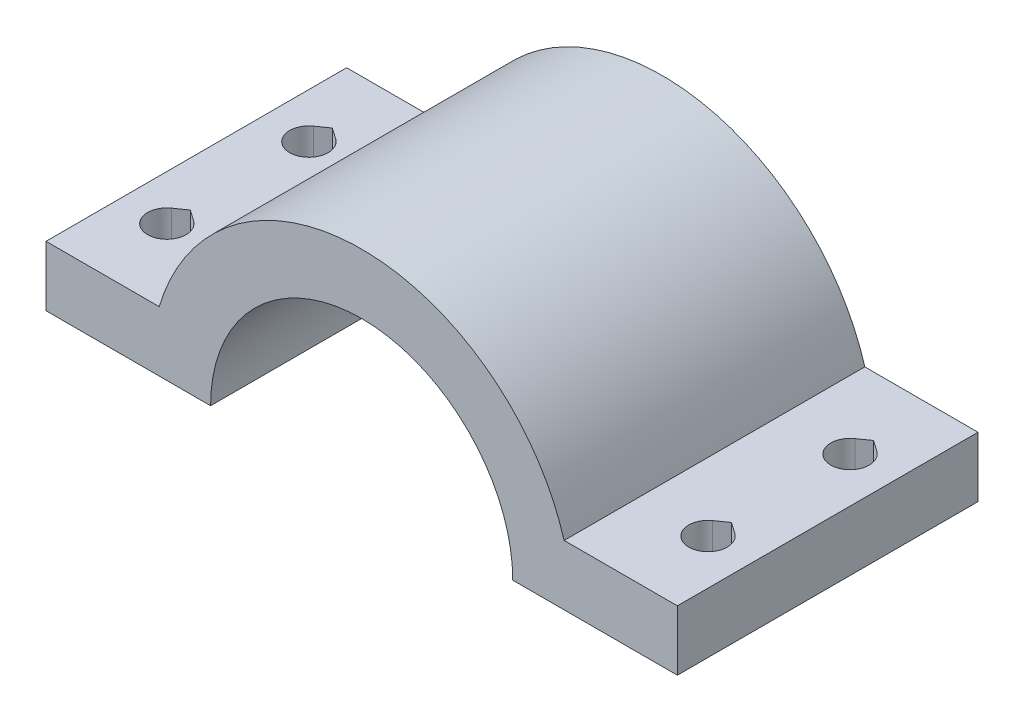
ISO-10303-21;
HEADER;
FILE_DESCRIPTION(('STEP AP214'),'2;1');
FILE_NAME('part.step','',(''),(''),'','','');
FILE_SCHEMA(('AUTOMOTIVE_DESIGN { 1 0 10303 214 1 1 1 1 }'));
ENDSEC;
DATA;
#1=APPLICATION_CONTEXT('core data for automotive mechanical design processes');
#2=APPLICATION_PROTOCOL_DEFINITION('international standard','automotive_design',2000,#1);
#3=PRODUCT_CONTEXT('',#1,'mechanical');
#4=PRODUCT('Part','Part','',(#3));
#5=PRODUCT_RELATED_PRODUCT_CATEGORY('part','',(#4));
#6=PRODUCT_DEFINITION_FORMATION('','',#4);
#7=PRODUCT_DEFINITION_CONTEXT('part definition',#1,'design');
#8=PRODUCT_DEFINITION('design','',#6,#7);
#9=PRODUCT_DEFINITION_SHAPE('','',#8);
#10=(LENGTH_UNIT() NAMED_UNIT(*) SI_UNIT(.MILLI.,.METRE.));
#11=(NAMED_UNIT(*) PLANE_ANGLE_UNIT() SI_UNIT($,.RADIAN.));
#12=(NAMED_UNIT(*) SI_UNIT($,.STERADIAN.) SOLID_ANGLE_UNIT());
#13=UNCERTAINTY_MEASURE_WITH_UNIT(LENGTH_MEASURE(1.E-05),#10,'distance_accuracy_value','');
#14=(GEOMETRIC_REPRESENTATION_CONTEXT(3) GLOBAL_UNCERTAINTY_ASSIGNED_CONTEXT((#13)) GLOBAL_UNIT_ASSIGNED_CONTEXT((#10,
#11,#12)) REPRESENTATION_CONTEXT('',''));
#15=CARTESIAN_POINT('',(0.,0.,0.));
#16=DIRECTION('',(0.,0.,1.));
#17=DIRECTION('',(1.,0.,0.));
#18=AXIS2_PLACEMENT_3D('',#15,#16,#17);
#19=CARTESIAN_POINT('',(0.,1.46237189024843E-13,25.4));
#20=DIRECTION('',(0.,1.,0.));
#21=DIRECTION('',(-1.,0.,0.));
#22=AXIS2_PLACEMENT_3D('',#19,#20,#21);
#23=PLANE('',#22);
#24=CARTESIAN_POINT('',(22.8599999999999,0.,18.9999998460001));
#25=DIRECTION('',(0.,1.,0.));
#26=DIRECTION('',(0.,0.,1.));
#27=AXIS2_PLACEMENT_3D('',#24,#25,#26);
#28=CIRCLE('',#27,1.625000052);
#29=CARTESIAN_POINT('',(23.7920617388964,0.,17.6688777314346));
#30=VERTEX_POINT('',#29);
#31=CARTESIAN_POINT('',(21.9279382611035,0.,17.6688777314345));
#32=VERTEX_POINT('',#31);
#33=EDGE_CURVE('E224',#30,#32,#28,.F.);
#34=ORIENTED_EDGE('',*,*,#33,.F.);
#35=DIRECTION('',(0.819152044288987,0.,0.573576436351053));
#36=VECTOR('',#35,1.);
#37=CARTESIAN_POINT('',(-0.474308324425683,0.,0.677382488109719));
#38=LINE('',#37,#36);
#39=CARTESIAN_POINT('',(22.8599999999999,0.,17.0162410757824));
#40=VERTEX_POINT('',#39);
#41=EDGE_CURVE('E227',#40,#30,#38,.T.);
#42=ORIENTED_EDGE('',*,*,#41,.F.);
#43=DIRECTION('',(-0.819152044288995,0.,0.573576436351041));
#44=VECTOR('',#43,1.);
#45=CARTESIAN_POINT('',(15.5157278480008,0.,22.1587557992758));
#46=LINE('',#45,#44);
#47=EDGE_CURVE('E231',#40,#32,#46,.T.);
#48=ORIENTED_EDGE('',*,*,#47,.T.);
#49=EDGE_LOOP('',(#34,#42,#48));
#50=FACE_BOUND('',#49,.T.);
#51=DIRECTION('',(1.,0.,0.));
#52=VECTOR('',#51,1.);
#53=CARTESIAN_POINT('',(0.,1.46237189024843E-13,0.));
#54=LINE('',#53,#52);
#55=CARTESIAN_POINT('',(12.7634999999999,0.,0.));
#56=VERTEX_POINT('',#55);
#57=CARTESIAN_POINT('',(26.6699999999999,0.,0.));
#58=VERTEX_POINT('',#57);
#59=EDGE_CURVE('E355',#56,#58,#54,.T.);
#60=ORIENTED_EDGE('',*,*,#59,.T.);
#61=DIRECTION('',(0.,0.,-1.));
#62=VECTOR('',#61,1.);
#63=CARTESIAN_POINT('',(26.6699999999999,0.,25.4));
#64=LINE('',#63,#62);
#65=CARTESIAN_POINT('',(26.6699999999999,0.,25.4));
#66=VERTEX_POINT('',#65);
#67=EDGE_CURVE('E391',#66,#58,#64,.T.);
#68=ORIENTED_EDGE('',*,*,#67,.F.);
#69=DIRECTION('',(1.,0.,0.));
#70=VECTOR('',#69,1.);
#71=CARTESIAN_POINT('',(0.,1.46237189024843E-13,25.4));
#72=LINE('',#71,#70);
#73=CARTESIAN_POINT('',(12.7634999999999,0.,25.4));
#74=VERTEX_POINT('',#73);
#75=EDGE_CURVE('E327',#74,#66,#72,.T.);
#76=ORIENTED_EDGE('',*,*,#75,.F.);
#77=DIRECTION('',(0.,0.,-1.));
#78=VECTOR('',#77,1.);
#79=CARTESIAN_POINT('',(12.7634999999999,0.,25.4));
#80=LINE('',#79,#78);
#81=EDGE_CURVE('E55',#74,#56,#80,.T.);
#82=ORIENTED_EDGE('',*,*,#81,.T.);
#83=EDGE_LOOP('',(#60,#68,#76,#82));
#84=FACE_BOUND('',#83,.T.);
#85=CARTESIAN_POINT('',(22.86,0.,6.99999997000007));
#86=DIRECTION('',(0.,1.,0.));
#87=DIRECTION('',(0.,0.,1.));
#88=AXIS2_PLACEMENT_3D('',#85,#86,#87);
#89=CIRCLE('',#88,1.625000052);
#90=CARTESIAN_POINT('',(23.7920617388964,0.,5.66887785543456));
#91=VERTEX_POINT('',#90);
#92=CARTESIAN_POINT('',(21.9279382611035,0.,5.66887785543455));
#93=VERTEX_POINT('',#92);
#94=EDGE_CURVE('E256',#91,#93,#89,.F.);
#95=ORIENTED_EDGE('',*,*,#94,.F.);
#96=DIRECTION('',(-0.819152044288988,0.,-0.573576436351051));
#97=VECTOR('',#96,1.);
#98=CARTESIAN_POINT('',(5.16384734202883,0.,-7.37473828863894));
#99=LINE('',#98,#97);
#100=CARTESIAN_POINT('',(22.86,0.,5.01624119978242));
#101=VERTEX_POINT('',#100);
#102=EDGE_CURVE('E259',#91,#101,#99,.T.);
#103=ORIENTED_EDGE('',*,*,#102,.T.);
#104=DIRECTION('',(-0.81915204428899,0.,0.573576436351048));
#105=VECTOR('',#104,1.);
#106=CARTESIAN_POINT('',(9.87757218154655,0.,14.106635022527));
#107=LINE('',#106,#105);
#108=EDGE_CURVE('E264',#101,#93,#107,.T.);
#109=ORIENTED_EDGE('',*,*,#108,.T.);
#110=EDGE_LOOP('',(#95,#103,#109));
#111=FACE_BOUND('',#110,.T.);
#112=ADVANCED_FACE('F46',(#50,#84,#111),#23,.F.);
#113=CARTESIAN_POINT('',(0.,5.08000000000001,25.4));
#114=DIRECTION('',(0.,-1.,0.));
#115=DIRECTION('',(1.,0.,0.));
#116=AXIS2_PLACEMENT_3D('',#113,#114,#115);
#117=PLANE('',#116);
#118=CARTESIAN_POINT('',(22.8599999999999,5.08,18.9999998460001));
#119=DIRECTION('',(0.,1.,0.));
#120=DIRECTION('',(0.,0.,1.));
#121=AXIS2_PLACEMENT_3D('',#118,#119,#120);
#122=CIRCLE('',#121,1.625000052);
#123=CARTESIAN_POINT('',(23.7920617388964,5.08000000000008,17.6688777314346));
#124=VERTEX_POINT('',#123);
#125=CARTESIAN_POINT('',(21.9279382611035,5.08,17.6688777314345));
#126=VERTEX_POINT('',#125);
#127=EDGE_CURVE('E236',#124,#126,#122,.F.);
#128=ORIENTED_EDGE('',*,*,#127,.T.);
#129=DIRECTION('',(-0.819152044288995,0.,0.573576436351041));
#130=VECTOR('',#129,1.);
#131=CARTESIAN_POINT('',(15.5157278480008,5.08,22.1587557992758));
#132=LINE('',#131,#130);
#133=CARTESIAN_POINT('',(22.8599999999999,5.08,17.0162410757824));
#134=VERTEX_POINT('',#133);
#135=EDGE_CURVE('E228',#134,#126,#132,.T.);
#136=ORIENTED_EDGE('',*,*,#135,.F.);
#137=DIRECTION('',(0.819152044288987,0.,0.573576436351053));
#138=VECTOR('',#137,1.);
#139=CARTESIAN_POINT('',(-0.474308324425683,5.08,0.677382488109719));
#140=LINE('',#139,#138);
#141=EDGE_CURVE('E240',#134,#124,#140,.T.);
#142=ORIENTED_EDGE('',*,*,#141,.T.);
#143=EDGE_LOOP('',(#128,#136,#142));
#144=FACE_BOUND('',#143,.T.);
#145=DIRECTION('',(-1.,0.,0.));
#146=VECTOR('',#145,1.);
#147=CARTESIAN_POINT('',(0.,5.08000000000001,0.));
#148=LINE('',#147,#146);
#149=CARTESIAN_POINT('',(26.6699999999999,5.08000000000009,0.));
#150=VERTEX_POINT('',#149);
#151=CARTESIAN_POINT('',(17.1050896592212,5.08000000000006,0.));
#152=VERTEX_POINT('',#151);
#153=EDGE_CURVE('E361',#150,#152,#148,.T.);
#154=ORIENTED_EDGE('',*,*,#153,.T.);
#155=DIRECTION('',(0.,0.,-1.));
#156=VECTOR('',#155,1.);
#157=CARTESIAN_POINT('',(17.1050896592212,5.08000000000006,25.4));
#158=LINE('',#157,#156);
#159=CARTESIAN_POINT('',(17.1050896592212,5.08000000000006,25.4));
#160=VERTEX_POINT('',#159);
#161=EDGE_CURVE('E383',#160,#152,#158,.T.);
#162=ORIENTED_EDGE('',*,*,#161,.F.);
#163=DIRECTION('',(-1.,0.,0.));
#164=VECTOR('',#163,1.);
#165=CARTESIAN_POINT('',(0.,5.08000000000001,25.4));
#166=LINE('',#165,#164);
#167=CARTESIAN_POINT('',(26.6699999999999,5.08000000000009,25.4));
#168=VERTEX_POINT('',#167);
#169=EDGE_CURVE('E333',#168,#160,#166,.T.);
#170=ORIENTED_EDGE('',*,*,#169,.F.);
#171=DIRECTION('',(0.,0.,-1.));
#172=VECTOR('',#171,1.);
#173=CARTESIAN_POINT('',(26.6699999999999,5.08000000000009,25.4));
#174=LINE('',#173,#172);
#175=EDGE_CURVE('E387',#168,#150,#174,.T.);
#176=ORIENTED_EDGE('',*,*,#175,.T.);
#177=EDGE_LOOP('',(#154,#162,#170,#176));
#178=FACE_BOUND('',#177,.T.);
#179=CARTESIAN_POINT('',(22.86,5.08,6.99999997000007));
#180=DIRECTION('',(0.,1.,0.));
#181=DIRECTION('',(0.,0.,1.));
#182=AXIS2_PLACEMENT_3D('',#179,#180,#181);
#183=CIRCLE('',#182,1.625000052);
#184=CARTESIAN_POINT('',(23.7920617388964,5.08000000000008,5.66887785543456));
#185=VERTEX_POINT('',#184);
#186=CARTESIAN_POINT('',(21.9279382611035,5.08,5.66887785543455));
#187=VERTEX_POINT('',#186);
#188=EDGE_CURVE('E269',#185,#187,#183,.F.);
#189=ORIENTED_EDGE('',*,*,#188,.T.);
#190=DIRECTION('',(-0.81915204428899,0.,0.573576436351048));
#191=VECTOR('',#190,1.);
#192=CARTESIAN_POINT('',(9.87757218154655,5.08,14.106635022527));
#193=LINE('',#192,#191);
#194=CARTESIAN_POINT('',(22.86,5.08,5.01624119978241));
#195=VERTEX_POINT('',#194);
#196=EDGE_CURVE('E260',#195,#187,#193,.T.);
#197=ORIENTED_EDGE('',*,*,#196,.F.);
#198=DIRECTION('',(-0.819152044288988,0.,-0.573576436351051));
#199=VECTOR('',#198,1.);
#200=CARTESIAN_POINT('',(5.16384734202883,5.08,-7.37473828863894));
#201=LINE('',#200,#199);
#202=EDGE_CURVE('E273',#185,#195,#201,.T.);
#203=ORIENTED_EDGE('',*,*,#202,.F.);
#204=EDGE_LOOP('',(#189,#197,#203));
#205=FACE_BOUND('',#204,.T.);
#206=ADVANCED_FACE('F427',(#144,#178,#205),#117,.F.);
#207=CARTESIAN_POINT('',(0.,0.,25.4));
#208=DIRECTION('',(0.,-1.,0.));
#209=DIRECTION('',(1.,0.,0.));
#210=AXIS2_PLACEMENT_3D('',#207,#208,#209);
#211=PLANE('',#210);
#212=CARTESIAN_POINT('',(-22.86,0.,18.999999846));
#213=DIRECTION('',(0.,1.,0.));
#214=DIRECTION('',(0.,0.,1.));
#215=AXIS2_PLACEMENT_3D('',#212,#213,#214);
#216=CIRCLE('',#215,1.625000052);
#217=CARTESIAN_POINT('',(-23.7920617388964,0.,17.6688777314345));
#218=VERTEX_POINT('',#217);
#219=CARTESIAN_POINT('',(-21.9279382611036,0.,17.6688777314345));
#220=VERTEX_POINT('',#219);
#221=EDGE_CURVE('E193',#218,#220,#216,.T.);
#222=ORIENTED_EDGE('',*,*,#221,.T.);
#223=DIRECTION('',(0.81915204428899,0.,0.573576436351048));
#224=VECTOR('',#223,1.);
#225=CARTESIAN_POINT('',(-15.515727848001,0.,22.1587557992757));
#226=LINE('',#225,#224);
#227=CARTESIAN_POINT('',(-22.86,0.,17.0162410757823));
#228=VERTEX_POINT('',#227);
#229=EDGE_CURVE('E183',#228,#220,#226,.T.);
#230=ORIENTED_EDGE('',*,*,#229,.F.);
#231=DIRECTION('',(-0.819152044288989,0.,0.57357643635105));
#232=VECTOR('',#231,1.);
#233=CARTESIAN_POINT('',(0.474308324425689,0.,0.677382488109733));
#234=LINE('',#233,#232);
#235=EDGE_CURVE('E62',#228,#218,#234,.T.);
#236=ORIENTED_EDGE('',*,*,#235,.T.);
#237=EDGE_LOOP('',(#222,#230,#236));
#238=FACE_BOUND('',#237,.T.);
#239=CARTESIAN_POINT('',(-22.86,0.,6.99999997));
#240=DIRECTION('',(0.,1.,0.));
#241=DIRECTION('',(0.,0.,1.));
#242=AXIS2_PLACEMENT_3D('',#239,#240,#241);
#243=CIRCLE('',#242,1.625000052);
#244=CARTESIAN_POINT('',(-23.7920617388964,0.,5.66887785543448));
#245=VERTEX_POINT('',#244);
#246=CARTESIAN_POINT('',(-21.9279382611036,0.,5.66887785543448));
#247=VERTEX_POINT('',#246);
#248=EDGE_CURVE('E288',#245,#247,#243,.T.);
#249=ORIENTED_EDGE('',*,*,#248,.T.);
#250=DIRECTION('',(0.819152044288989,0.,0.57357643635105));
#251=VECTOR('',#250,1.);
#252=CARTESIAN_POINT('',(-9.87757218154658,0.,14.106635022527));
#253=LINE('',#252,#251);
#254=CARTESIAN_POINT('',(-22.86,0.,5.01624119978234));
#255=VERTEX_POINT('',#254);
#256=EDGE_CURVE('E292',#255,#247,#253,.T.);
#257=ORIENTED_EDGE('',*,*,#256,.F.);
#258=DIRECTION('',(0.819152044288989,0.,-0.57357643635105));
#259=VECTOR('',#258,1.);
#260=CARTESIAN_POINT('',(-5.16384734202884,0.,-7.37473828863898));
#261=LINE('',#260,#259);
#262=EDGE_CURVE('E296',#245,#255,#261,.T.);
#263=ORIENTED_EDGE('',*,*,#262,.F.);
#264=EDGE_LOOP('',(#249,#257,#263));
#265=FACE_BOUND('',#264,.T.);
#266=DIRECTION('',(-1.,0.,0.));
#267=VECTOR('',#266,1.);
#268=CARTESIAN_POINT('',(0.,0.,0.));
#269=LINE('',#268,#267);
#270=CARTESIAN_POINT('',(-12.7635,0.,0.));
#271=VERTEX_POINT('',#270);
#272=CARTESIAN_POINT('',(-26.67,0.,0.));
#273=VERTEX_POINT('',#272);
#274=EDGE_CURVE('E312',#271,#273,#269,.T.);
#275=ORIENTED_EDGE('',*,*,#274,.F.);
#276=DIRECTION('',(0.,0.,-1.));
#277=VECTOR('',#276,1.);
#278=CARTESIAN_POINT('',(-12.7635,0.,25.4));
#279=LINE('',#278,#277);
#280=CARTESIAN_POINT('',(-12.7635,0.,25.4));
#281=VERTEX_POINT('',#280);
#282=EDGE_CURVE('E11',#281,#271,#279,.T.);
#283=ORIENTED_EDGE('',*,*,#282,.F.);
#284=DIRECTION('',(-1.,0.,0.));
#285=VECTOR('',#284,1.);
#286=CARTESIAN_POINT('',(0.,0.,25.4));
#287=LINE('',#286,#285);
#288=CARTESIAN_POINT('',(-26.67,0.,25.4));
#289=VERTEX_POINT('',#288);
#290=EDGE_CURVE('E318',#281,#289,#287,.T.);
#291=ORIENTED_EDGE('',*,*,#290,.T.);
#292=DIRECTION('',(0.,0.,-1.));
#293=VECTOR('',#292,1.);
#294=CARTESIAN_POINT('',(-26.67,0.,25.4));
#295=LINE('',#294,#293);
#296=EDGE_CURVE('E347',#289,#273,#295,.T.);
#297=ORIENTED_EDGE('',*,*,#296,.T.);
#298=EDGE_LOOP('',(#275,#283,#291,#297));
#299=FACE_BOUND('',#298,.T.);
#300=ADVANCED_FACE('F48',(#238,#265,#299),#211,.T.);
#301=CARTESIAN_POINT('',(0.,0.,25.4));
#302=DIRECTION('',(0.,0.,-1.));
#303=DIRECTION('',(-1.,0.,0.));
#304=AXIS2_PLACEMENT_3D('',#301,#302,#303);
#305=CYLINDRICAL_SURFACE('',#304,12.7635);
#306=CARTESIAN_POINT('',(0.,0.,0.));
#307=DIRECTION('',(0.,0.,1.));
#308=DIRECTION('',(1.,0.,0.));
#309=AXIS2_PLACEMENT_3D('',#306,#307,#308);
#310=CIRCLE('',#309,12.7635);
#311=EDGE_CURVE('E351',#56,#271,#310,.T.);
#312=ORIENTED_EDGE('',*,*,#311,.F.);
#313=ORIENTED_EDGE('',*,*,#81,.F.);
#314=CARTESIAN_POINT('',(0.,0.,25.4));
#315=DIRECTION('',(0.,0.,1.));
#316=DIRECTION('',(1.,0.,0.));
#317=AXIS2_PLACEMENT_3D('',#314,#315,#316);
#318=CIRCLE('',#317,12.7635);
#319=EDGE_CURVE('E322',#74,#281,#318,.T.);
#320=ORIENTED_EDGE('',*,*,#319,.T.);
#321=ORIENTED_EDGE('',*,*,#282,.T.);
#322=EDGE_LOOP('',(#312,#313,#320,#321));
#323=FACE_BOUND('',#322,.T.);
#324=ADVANCED_FACE('F407',(#323),#305,.F.);
#325=CARTESIAN_POINT('',(26.6699999999999,0.,25.4));
#326=DIRECTION('',(-1.,0.,0.));
#327=DIRECTION('',(0.,-1.,0.));
#328=AXIS2_PLACEMENT_3D('',#325,#326,#327);
#329=PLANE('',#328);
#330=DIRECTION('',(0.,1.,0.));
#331=VECTOR('',#330,1.);
#332=CARTESIAN_POINT('',(26.6699999999999,0.,0.));
#333=LINE('',#332,#331);
#334=EDGE_CURVE('E358',#58,#150,#333,.T.);
#335=ORIENTED_EDGE('',*,*,#334,.T.);
#336=ORIENTED_EDGE('',*,*,#175,.F.);
#337=DIRECTION('',(0.,1.,0.));
#338=VECTOR('',#337,1.);
#339=CARTESIAN_POINT('',(26.6699999999999,0.,25.4));
#340=LINE('',#339,#338);
#341=EDGE_CURVE('E330',#66,#168,#340,.T.);
#342=ORIENTED_EDGE('',*,*,#341,.F.);
#343=ORIENTED_EDGE('',*,*,#67,.T.);
#344=EDGE_LOOP('',(#335,#336,#342,#343));
#345=FACE_BOUND('',#344,.T.);
#346=ADVANCED_FACE('F432',(#345),#329,.F.);
#347=CARTESIAN_POINT('',(0.,0.,25.4));
#348=DIRECTION('',(0.,0.,-1.));
#349=DIRECTION('',(-1.,0.,0.));
#350=AXIS2_PLACEMENT_3D('',#347,#348,#349);
#351=CYLINDRICAL_SURFACE('',#350,17.8435);
#352=CARTESIAN_POINT('',(0.,0.,0.));
#353=DIRECTION('',(0.,0.,1.));
#354=DIRECTION('',(1.,0.,0.));
#355=AXIS2_PLACEMENT_3D('',#352,#353,#354);
#356=CIRCLE('',#355,17.8435);
#357=CARTESIAN_POINT('',(-17.1050896592213,5.08,0.));
#358=VERTEX_POINT('',#357);
#359=EDGE_CURVE('E364',#152,#358,#356,.T.);
#360=ORIENTED_EDGE('',*,*,#359,.T.);
#361=DIRECTION('',(0.,0.,-1.));
#362=VECTOR('',#361,1.);
#363=CARTESIAN_POINT('',(-17.1050896592213,5.08,25.4));
#364=LINE('',#363,#362);
#365=CARTESIAN_POINT('',(-17.1050896592213,5.08,25.4));
#366=VERTEX_POINT('',#365);
#367=EDGE_CURVE('E380',#366,#358,#364,.T.);
#368=ORIENTED_EDGE('',*,*,#367,.F.);
#369=CARTESIAN_POINT('',(0.,0.,25.4));
#370=DIRECTION('',(0.,0.,1.));
#371=DIRECTION('',(1.,0.,0.));
#372=AXIS2_PLACEMENT_3D('',#369,#370,#371);
#373=CIRCLE('',#372,17.8435);
#374=EDGE_CURVE('E336',#160,#366,#373,.T.);
#375=ORIENTED_EDGE('',*,*,#374,.F.);
#376=ORIENTED_EDGE('',*,*,#161,.T.);
#377=EDGE_LOOP('',(#360,#368,#375,#376));
#378=FACE_BOUND('',#377,.T.);
#379=ADVANCED_FACE('F422',(#378),#351,.T.);
#380=CARTESIAN_POINT('',(0.,5.08,25.4));
#381=DIRECTION('',(0.,1.,0.));
#382=DIRECTION('',(0.,0.,1.));
#383=AXIS2_PLACEMENT_3D('',#380,#381,#382);
#384=PLANE('',#383);
#385=CARTESIAN_POINT('',(-22.86,5.08,18.999999846));
#386=DIRECTION('',(0.,1.,0.));
#387=DIRECTION('',(0.,0.,1.));
#388=AXIS2_PLACEMENT_3D('',#385,#386,#387);
#389=CIRCLE('',#388,1.625000052);
#390=CARTESIAN_POINT('',(-23.7920617388964,5.08,17.6688777314345));
#391=VERTEX_POINT('',#390);
#392=CARTESIAN_POINT('',(-21.9279382611036,5.08,17.6688777314345));
#393=VERTEX_POINT('',#392);
#394=EDGE_CURVE('E199',#391,#393,#389,.T.);
#395=ORIENTED_EDGE('',*,*,#394,.F.);
#396=DIRECTION('',(-0.819152044288989,0.,0.57357643635105));
#397=VECTOR('',#396,1.);
#398=CARTESIAN_POINT('',(0.474308324425689,5.08,0.677382488109733));
#399=LINE('',#398,#397);
#400=CARTESIAN_POINT('',(-22.86,5.08,17.0162410757824));
#401=VERTEX_POINT('',#400);
#402=EDGE_CURVE('E204',#401,#391,#399,.T.);
#403=ORIENTED_EDGE('',*,*,#402,.F.);
#404=DIRECTION('',(0.81915204428899,0.,0.573576436351048));
#405=VECTOR('',#404,1.);
#406=CARTESIAN_POINT('',(-15.515727848001,5.08,22.1587557992757));
#407=LINE('',#406,#405);
#408=EDGE_CURVE('E208',#401,#393,#407,.T.);
#409=ORIENTED_EDGE('',*,*,#408,.T.);
#410=EDGE_LOOP('',(#395,#403,#409));
#411=FACE_BOUND('',#410,.T.);
#412=CARTESIAN_POINT('',(-22.86,5.08,6.99999997));
#413=DIRECTION('',(0.,1.,0.));
#414=DIRECTION('',(0.,0.,1.));
#415=AXIS2_PLACEMENT_3D('',#412,#413,#414);
#416=CIRCLE('',#415,1.625000052);
#417=CARTESIAN_POINT('',(-23.7920617388964,5.08,5.66887785543448));
#418=VERTEX_POINT('',#417);
#419=CARTESIAN_POINT('',(-21.9279382611036,5.08,5.66887785543449));
#420=VERTEX_POINT('',#419);
#421=EDGE_CURVE('E221',#418,#420,#416,.T.);
#422=ORIENTED_EDGE('',*,*,#421,.F.);
#423=DIRECTION('',(0.819152044288989,0.,-0.57357643635105));
#424=VECTOR('',#423,1.);
#425=CARTESIAN_POINT('',(-5.16384734202884,5.08,-7.37473828863898));
#426=LINE('',#425,#424);
#427=CARTESIAN_POINT('',(-22.86,5.08,5.01624119978235));
#428=VERTEX_POINT('',#427);
#429=EDGE_CURVE('E293',#418,#428,#426,.T.);
#430=ORIENTED_EDGE('',*,*,#429,.T.);
#431=DIRECTION('',(0.819152044288989,0.,0.57357643635105));
#432=VECTOR('',#431,1.);
#433=CARTESIAN_POINT('',(-9.87757218154658,5.08,14.106635022527));
#434=LINE('',#433,#432);
#435=EDGE_CURVE('E302',#428,#420,#434,.T.);
#436=ORIENTED_EDGE('',*,*,#435,.T.);
#437=EDGE_LOOP('',(#422,#430,#436));
#438=FACE_BOUND('',#437,.T.);
#439=DIRECTION('',(1.,0.,0.));
#440=VECTOR('',#439,1.);
#441=CARTESIAN_POINT('',(0.,5.08,0.));
#442=LINE('',#441,#440);
#443=CARTESIAN_POINT('',(-26.67,5.08,0.));
#444=VERTEX_POINT('',#443);
#445=EDGE_CURVE('E368',#444,#358,#442,.T.);
#446=ORIENTED_EDGE('',*,*,#445,.F.);
#447=DIRECTION('',(0.,0.,-1.));
#448=VECTOR('',#447,1.);
#449=CARTESIAN_POINT('',(-26.67,5.08,25.4));
#450=LINE('',#449,#448);
#451=CARTESIAN_POINT('',(-26.67,5.08,25.4));
#452=VERTEX_POINT('',#451);
#453=EDGE_CURVE('E377',#452,#444,#450,.T.);
#454=ORIENTED_EDGE('',*,*,#453,.F.);
#455=DIRECTION('',(1.,0.,0.));
#456=VECTOR('',#455,1.);
#457=CARTESIAN_POINT('',(0.,5.08,25.4));
#458=LINE('',#457,#456);
#459=EDGE_CURVE('E339',#452,#366,#458,.T.);
#460=ORIENTED_EDGE('',*,*,#459,.T.);
#461=ORIENTED_EDGE('',*,*,#367,.T.);
#462=EDGE_LOOP('',(#446,#454,#460,#461));
#463=FACE_BOUND('',#462,.T.);
#464=ADVANCED_FACE('F418',(#411,#438,#463),#384,.T.);
#465=CARTESIAN_POINT('',(-26.67,0.,25.4));
#466=DIRECTION('',(-1.,0.,0.));
#467=DIRECTION('',(0.,0.,1.));
#468=AXIS2_PLACEMENT_3D('',#465,#466,#467);
#469=PLANE('',#468);
#470=DIRECTION('',(0.,1.,0.));
#471=VECTOR('',#470,1.);
#472=CARTESIAN_POINT('',(-26.67,0.,0.));
#473=LINE('',#472,#471);
#474=EDGE_CURVE('E323',#273,#444,#473,.T.);
#475=ORIENTED_EDGE('',*,*,#474,.F.);
#476=ORIENTED_EDGE('',*,*,#296,.F.);
#477=DIRECTION('',(0.,1.,0.));
#478=VECTOR('',#477,1.);
#479=CARTESIAN_POINT('',(-26.67,0.,25.4));
#480=LINE('',#479,#478);
#481=EDGE_CURVE('E343',#289,#452,#480,.T.);
#482=ORIENTED_EDGE('',*,*,#481,.T.);
#483=ORIENTED_EDGE('',*,*,#453,.T.);
#484=EDGE_LOOP('',(#475,#476,#482,#483));
#485=FACE_BOUND('',#484,.T.);
#486=ADVANCED_FACE('F413',(#485),#469,.T.);
#487=CARTESIAN_POINT('',(0.,0.,25.4));
#488=DIRECTION('',(0.,0.,1.));
#489=DIRECTION('',(1.,0.,0.));
#490=AXIS2_PLACEMENT_3D('',#487,#488,#489);
#491=PLANE('',#490);
#492=ORIENTED_EDGE('',*,*,#290,.F.);
#493=ORIENTED_EDGE('',*,*,#319,.F.);
#494=ORIENTED_EDGE('',*,*,#75,.T.);
#495=ORIENTED_EDGE('',*,*,#341,.T.);
#496=ORIENTED_EDGE('',*,*,#169,.T.);
#497=ORIENTED_EDGE('',*,*,#374,.T.);
#498=ORIENTED_EDGE('',*,*,#459,.F.);
#499=ORIENTED_EDGE('',*,*,#481,.F.);
#500=EDGE_LOOP('',(#492,#493,#494,#495,#496,#497,#498,#499));
#501=FACE_BOUND('',#500,.T.);
#502=ADVANCED_FACE('F434',(#501),#491,.T.);
#503=CARTESIAN_POINT('',(0.,0.,0.));
#504=DIRECTION('',(0.,0.,1.));
#505=DIRECTION('',(1.,0.,0.));
#506=AXIS2_PLACEMENT_3D('',#503,#504,#505);
#507=PLANE('',#506);
#508=ORIENTED_EDGE('',*,*,#274,.T.);
#509=ORIENTED_EDGE('',*,*,#474,.T.);
#510=ORIENTED_EDGE('',*,*,#445,.T.);
#511=ORIENTED_EDGE('',*,*,#359,.F.);
#512=ORIENTED_EDGE('',*,*,#153,.F.);
#513=ORIENTED_EDGE('',*,*,#334,.F.);
#514=ORIENTED_EDGE('',*,*,#59,.F.);
#515=ORIENTED_EDGE('',*,*,#311,.T.);
#516=EDGE_LOOP('',(#508,#509,#510,#511,#512,#513,#514,#515));
#517=FACE_BOUND('',#516,.T.);
#518=ADVANCED_FACE('F405',(#517),#507,.F.);
#519=CARTESIAN_POINT('',(-22.86,0.,6.99999997));
#520=DIRECTION('',(0.,1.,0.));
#521=DIRECTION('',(0.,0.,1.));
#522=AXIS2_PLACEMENT_3D('',#519,#520,#521);
#523=CYLINDRICAL_SURFACE('',#522,1.625000052);
#524=ORIENTED_EDGE('',*,*,#421,.T.);
#525=DIRECTION('',(0.,1.,0.));
#526=VECTOR('',#525,1.);
#527=CARTESIAN_POINT('',(-21.9279382611036,0.,5.66887785543448));
#528=LINE('',#527,#526);
#529=EDGE_CURVE('E299',#247,#420,#528,.T.);
#530=ORIENTED_EDGE('',*,*,#529,.F.);
#531=ORIENTED_EDGE('',*,*,#248,.F.);
#532=DIRECTION('',(0.,1.,0.));
#533=VECTOR('',#532,1.);
#534=CARTESIAN_POINT('',(-23.7920617388964,0.,5.66887785543448));
#535=LINE('',#534,#533);
#536=EDGE_CURVE('E309',#245,#418,#535,.T.);
#537=ORIENTED_EDGE('',*,*,#536,.T.);
#538=EDGE_LOOP('',(#524,#530,#531,#537));
#539=FACE_BOUND('',#538,.T.);
#540=ADVANCED_FACE('F441',(#539),#523,.F.);
#541=CARTESIAN_POINT('',(-5.16384734202884,0.,-7.37473828863898));
#542=DIRECTION('',(0.57357643635105,0.,0.819152044288989));
#543=DIRECTION('',(0.819152044288989,0.,-0.57357643635105));
#544=AXIS2_PLACEMENT_3D('',#541,#542,#543);
#545=PLANE('',#544);
#546=ORIENTED_EDGE('',*,*,#429,.F.);
#547=ORIENTED_EDGE('',*,*,#536,.F.);
#548=ORIENTED_EDGE('',*,*,#262,.T.);
#549=DIRECTION('',(0.,1.,0.));
#550=VECTOR('',#549,1.);
#551=CARTESIAN_POINT('',(-22.86,0.,5.01624119978235));
#552=LINE('',#551,#550);
#553=EDGE_CURVE('E70',#255,#428,#552,.T.);
#554=ORIENTED_EDGE('',*,*,#553,.T.);
#555=EDGE_LOOP('',(#546,#547,#548,#554));
#556=FACE_BOUND('',#555,.T.);
#557=ADVANCED_FACE('F480',(#556),#545,.T.);
#558=CARTESIAN_POINT('',(-9.87757218154658,0.,14.106635022527));
#559=DIRECTION('',(-0.57357643635105,0.,0.819152044288989));
#560=DIRECTION('',(0.819152044288989,0.,0.57357643635105));
#561=AXIS2_PLACEMENT_3D('',#558,#559,#560);
#562=PLANE('',#561);
#563=ORIENTED_EDGE('',*,*,#435,.F.);
#564=ORIENTED_EDGE('',*,*,#553,.F.);
#565=ORIENTED_EDGE('',*,*,#256,.T.);
#566=ORIENTED_EDGE('',*,*,#529,.T.);
#567=EDGE_LOOP('',(#563,#564,#565,#566));
#568=FACE_BOUND('',#567,.T.);
#569=ADVANCED_FACE('F488',(#568),#562,.T.);
#570=CARTESIAN_POINT('',(-22.86,0.,18.999999846));
#571=DIRECTION('',(0.,1.,0.));
#572=DIRECTION('',(0.,0.,1.));
#573=AXIS2_PLACEMENT_3D('',#570,#571,#572);
#574=CYLINDRICAL_SURFACE('',#573,1.625000052);
#575=ORIENTED_EDGE('',*,*,#394,.T.);
#576=DIRECTION('',(0.,1.,0.));
#577=VECTOR('',#576,1.);
#578=CARTESIAN_POINT('',(-21.9279382611036,0.,17.6688777314345));
#579=LINE('',#578,#577);
#580=EDGE_CURVE('E187',#220,#393,#579,.T.);
#581=ORIENTED_EDGE('',*,*,#580,.F.);
#582=ORIENTED_EDGE('',*,*,#221,.F.);
#583=DIRECTION('',(0.,1.,0.));
#584=VECTOR('',#583,1.);
#585=CARTESIAN_POINT('',(-23.7920617388964,0.,17.6688777314345));
#586=LINE('',#585,#584);
#587=EDGE_CURVE('E218',#218,#391,#586,.T.);
#588=ORIENTED_EDGE('',*,*,#587,.T.);
#589=EDGE_LOOP('',(#575,#581,#582,#588));
#590=FACE_BOUND('',#589,.T.);
#591=ADVANCED_FACE('F197',(#590),#574,.F.);
#592=CARTESIAN_POINT('',(0.474308324425689,0.,0.677382488109733));
#593=DIRECTION('',(-0.57357643635105,0.,-0.819152044288989));
#594=DIRECTION('',(-0.819152044288989,0.,0.57357643635105));
#595=AXIS2_PLACEMENT_3D('',#592,#593,#594);
#596=PLANE('',#595);
#597=ORIENTED_EDGE('',*,*,#402,.T.);
#598=ORIENTED_EDGE('',*,*,#587,.F.);
#599=ORIENTED_EDGE('',*,*,#235,.F.);
#600=DIRECTION('',(0.,1.,0.));
#601=VECTOR('',#600,1.);
#602=CARTESIAN_POINT('',(-22.86,0.,17.0162410757824));
#603=LINE('',#602,#601);
#604=EDGE_CURVE('E189',#228,#401,#603,.T.);
#605=ORIENTED_EDGE('',*,*,#604,.T.);
#606=EDGE_LOOP('',(#597,#598,#599,#605));
#607=FACE_BOUND('',#606,.T.);
#608=ADVANCED_FACE('F504',(#607),#596,.F.);
#609=CARTESIAN_POINT('',(-15.515727848001,0.,22.1587557992757));
#610=DIRECTION('',(-0.573576436351048,0.,0.819152044288991));
#611=DIRECTION('',(0.819152044288991,0.,0.573576436351048));
#612=AXIS2_PLACEMENT_3D('',#609,#610,#611);
#613=PLANE('',#612);
#614=ORIENTED_EDGE('',*,*,#408,.F.);
#615=ORIENTED_EDGE('',*,*,#604,.F.);
#616=ORIENTED_EDGE('',*,*,#229,.T.);
#617=ORIENTED_EDGE('',*,*,#580,.T.);
#618=EDGE_LOOP('',(#614,#615,#616,#617));
#619=FACE_BOUND('',#618,.T.);
#620=ADVANCED_FACE('F186',(#619),#613,.T.);
#621=CARTESIAN_POINT('',(22.8599999999999,0.,18.9999998460001));
#622=DIRECTION('',(0.,1.,0.));
#623=DIRECTION('',(0.,0.,1.));
#624=AXIS2_PLACEMENT_3D('',#621,#622,#623);
#625=CYLINDRICAL_SURFACE('',#624,1.625000052);
#626=ORIENTED_EDGE('',*,*,#127,.F.);
#627=DIRECTION('',(0.,1.,0.));
#628=VECTOR('',#627,1.);
#629=CARTESIAN_POINT('',(23.7920617388964,0.,17.6688777314346));
#630=LINE('',#629,#628);
#631=EDGE_CURVE('E235',#30,#124,#630,.T.);
#632=ORIENTED_EDGE('',*,*,#631,.F.);
#633=ORIENTED_EDGE('',*,*,#33,.T.);
#634=DIRECTION('',(0.,1.,0.));
#635=VECTOR('',#634,1.);
#636=CARTESIAN_POINT('',(21.9279382611035,0.,17.6688777314345));
#637=LINE('',#636,#635);
#638=EDGE_CURVE('E215',#32,#126,#637,.T.);
#639=ORIENTED_EDGE('',*,*,#638,.T.);
#640=EDGE_LOOP('',(#626,#632,#633,#639));
#641=FACE_BOUND('',#640,.T.);
#642=ADVANCED_FACE('F519',(#641),#625,.F.);
#643=CARTESIAN_POINT('',(15.5157278480008,0.,22.1587557992758));
#644=DIRECTION('',(-0.573576436351041,0.,-0.819152044288995));
#645=DIRECTION('',(-0.819152044288995,0.,0.573576436351041));
#646=AXIS2_PLACEMENT_3D('',#643,#644,#645);
#647=PLANE('',#646);
#648=ORIENTED_EDGE('',*,*,#135,.T.);
#649=ORIENTED_EDGE('',*,*,#638,.F.);
#650=ORIENTED_EDGE('',*,*,#47,.F.);
#651=DIRECTION('',(0.,1.,0.));
#652=VECTOR('',#651,1.);
#653=CARTESIAN_POINT('',(22.8599999999999,0.,17.0162410757824));
#654=LINE('',#653,#652);
#655=EDGE_CURVE('E250',#40,#134,#654,.T.);
#656=ORIENTED_EDGE('',*,*,#655,.T.);
#657=EDGE_LOOP('',(#648,#649,#650,#656));
#658=FACE_BOUND('',#657,.T.);
#659=ADVANCED_FACE('F527',(#658),#647,.F.);
#660=CARTESIAN_POINT('',(-0.474308324425683,0.,0.677382488109719));
#661=DIRECTION('',(-0.573576436351053,0.,0.819152044288987));
#662=DIRECTION('',(0.819152044288987,0.,0.573576436351053));
#663=AXIS2_PLACEMENT_3D('',#660,#661,#662);
#664=PLANE('',#663);
#665=ORIENTED_EDGE('',*,*,#141,.F.);
#666=ORIENTED_EDGE('',*,*,#655,.F.);
#667=ORIENTED_EDGE('',*,*,#41,.T.);
#668=ORIENTED_EDGE('',*,*,#631,.T.);
#669=EDGE_LOOP('',(#665,#666,#667,#668));
#670=FACE_BOUND('',#669,.T.);
#671=ADVANCED_FACE('F536',(#670),#664,.T.);
#672=CARTESIAN_POINT('',(22.86,0.,6.99999997000007));
#673=DIRECTION('',(0.,1.,0.));
#674=DIRECTION('',(0.,0.,1.));
#675=AXIS2_PLACEMENT_3D('',#672,#673,#674);
#676=CYLINDRICAL_SURFACE('',#675,1.625000052);
#677=ORIENTED_EDGE('',*,*,#188,.F.);
#678=DIRECTION('',(0.,1.,0.));
#679=VECTOR('',#678,1.);
#680=CARTESIAN_POINT('',(23.7920617388964,0.,5.66887785543456));
#681=LINE('',#680,#679);
#682=EDGE_CURVE('E268',#91,#185,#681,.T.);
#683=ORIENTED_EDGE('',*,*,#682,.F.);
#684=ORIENTED_EDGE('',*,*,#94,.T.);
#685=DIRECTION('',(0.,1.,0.));
#686=VECTOR('',#685,1.);
#687=CARTESIAN_POINT('',(21.9279382611035,0.,5.66887785543455));
#688=LINE('',#687,#686);
#689=EDGE_CURVE('E241',#93,#187,#688,.T.);
#690=ORIENTED_EDGE('',*,*,#689,.T.);
#691=EDGE_LOOP('',(#677,#683,#684,#690));
#692=FACE_BOUND('',#691,.T.);
#693=ADVANCED_FACE('F545',(#692),#676,.F.);
#694=CARTESIAN_POINT('',(9.87757218154655,0.,14.106635022527));
#695=DIRECTION('',(-0.573576436351048,0.,-0.819152044288991));
#696=DIRECTION('',(-0.819152044288991,0.,0.573576436351048));
#697=AXIS2_PLACEMENT_3D('',#694,#695,#696);
#698=PLANE('',#697);
#699=ORIENTED_EDGE('',*,*,#196,.T.);
#700=ORIENTED_EDGE('',*,*,#689,.F.);
#701=ORIENTED_EDGE('',*,*,#108,.F.);
#702=DIRECTION('',(0.,1.,0.));
#703=VECTOR('',#702,1.);
#704=CARTESIAN_POINT('',(22.86,0.,5.01624119978241));
#705=LINE('',#704,#703);
#706=EDGE_CURVE('E282',#101,#195,#705,.T.);
#707=ORIENTED_EDGE('',*,*,#706,.T.);
#708=EDGE_LOOP('',(#699,#700,#701,#707));
#709=FACE_BOUND('',#708,.T.);
#710=ADVANCED_FACE('F554',(#709),#698,.F.);
#711=CARTESIAN_POINT('',(5.16384734202883,0.,-7.37473828863894));
#712=DIRECTION('',(0.573576436351051,0.,-0.819152044288988));
#713=DIRECTION('',(-0.819152044288988,0.,-0.573576436351051));
#714=AXIS2_PLACEMENT_3D('',#711,#712,#713);
#715=PLANE('',#714);
#716=ORIENTED_EDGE('',*,*,#202,.T.);
#717=ORIENTED_EDGE('',*,*,#706,.F.);
#718=ORIENTED_EDGE('',*,*,#102,.F.);
#719=ORIENTED_EDGE('',*,*,#682,.T.);
#720=EDGE_LOOP('',(#716,#717,#718,#719));
#721=FACE_BOUND('',#720,.T.);
#722=ADVANCED_FACE('F563',(#721),#715,.F.);
#723=CLOSED_SHELL('',(#112,#206,#300,#324,#346,#379,#464,#486,#502,#518,#540,#557,#569,#591,
#608,#620,#642,#659,#671,#693,#710,#722));
#724=MANIFOLD_SOLID_BREP('B2',#723);
#725=ADVANCED_BREP_SHAPE_REPRESENTATION('',(#18,#724),#14);
#726=SHAPE_DEFINITION_REPRESENTATION(#9,#725);
ENDSEC;
END-ISO-10303-21;
